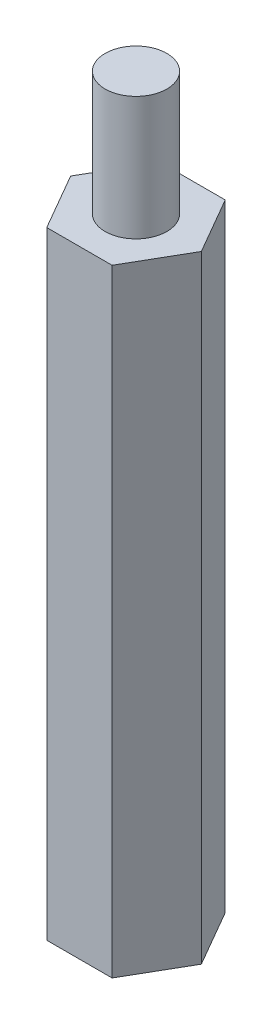
ISO-10303-21;
HEADER;
FILE_DESCRIPTION(('STEP AP214'),'2;1');
FILE_NAME('part.step','',(''),(''),'','','');
FILE_SCHEMA(('AUTOMOTIVE_DESIGN { 1 0 10303 214 1 1 1 1 }'));
ENDSEC;
DATA;
#1=APPLICATION_CONTEXT('core data for automotive mechanical design processes');
#2=APPLICATION_PROTOCOL_DEFINITION('international standard','automotive_design',2000,#1);
#3=PRODUCT_CONTEXT('',#1,'mechanical');
#4=PRODUCT('Part','Part','',(#3));
#5=PRODUCT_RELATED_PRODUCT_CATEGORY('part','',(#4));
#6=PRODUCT_DEFINITION_FORMATION('','',#4);
#7=PRODUCT_DEFINITION_CONTEXT('part definition',#1,'design');
#8=PRODUCT_DEFINITION('design','',#6,#7);
#9=PRODUCT_DEFINITION_SHAPE('','',#8);
#10=(LENGTH_UNIT() NAMED_UNIT(*) SI_UNIT(.MILLI.,.METRE.));
#11=(NAMED_UNIT(*) PLANE_ANGLE_UNIT() SI_UNIT($,.RADIAN.));
#12=(NAMED_UNIT(*) SI_UNIT($,.STERADIAN.) SOLID_ANGLE_UNIT());
#13=UNCERTAINTY_MEASURE_WITH_UNIT(LENGTH_MEASURE(1.E-05),#10,'distance_accuracy_value','');
#14=(GEOMETRIC_REPRESENTATION_CONTEXT(3) GLOBAL_UNCERTAINTY_ASSIGNED_CONTEXT((#13)) GLOBAL_UNIT_ASSIGNED_CONTEXT((#10,
#11,#12)) REPRESENTATION_CONTEXT('',''));
#15=CARTESIAN_POINT('',(0.,0.,0.));
#16=DIRECTION('',(0.,0.,1.));
#17=DIRECTION('',(1.,0.,0.));
#18=AXIS2_PLACEMENT_3D('',#15,#16,#17);
#19=CARTESIAN_POINT('',(-1.58771324027147,30.,2.75));
#20=DIRECTION('',(0.,0.,-1.));
#21=DIRECTION('',(-1.,0.,0.));
#22=AXIS2_PLACEMENT_3D('',#19,#20,#21);
#23=PLANE('',#22);
#24=DIRECTION('',(1.,0.,0.));
#25=VECTOR('',#24,1.);
#26=CARTESIAN_POINT('',(-1.58771324027147,0.,2.75));
#27=LINE('',#26,#25);
#28=CARTESIAN_POINT('',(-1.58771324027147,0.,2.75));
#29=VERTEX_POINT('',#28);
#30=CARTESIAN_POINT('',(1.58771324027147,0.,2.75));
#31=VERTEX_POINT('',#30);
#32=EDGE_CURVE('E119',#29,#31,#27,.T.);
#33=ORIENTED_EDGE('',*,*,#32,.T.);
#34=DIRECTION('',(0.,-1.,0.));
#35=VECTOR('',#34,1.);
#36=CARTESIAN_POINT('',(1.58771324027147,30.,2.75));
#37=LINE('',#36,#35);
#38=CARTESIAN_POINT('',(1.58771324027147,30.,2.75));
#39=VERTEX_POINT('',#38);
#40=EDGE_CURVE('E36',#39,#31,#37,.T.);
#41=ORIENTED_EDGE('',*,*,#40,.F.);
#42=DIRECTION('',(1.,0.,0.));
#43=VECTOR('',#42,1.);
#44=CARTESIAN_POINT('',(-1.58771324027147,30.,2.75));
#45=LINE('',#44,#43);
#46=CARTESIAN_POINT('',(-1.58771324027147,30.,2.75));
#47=VERTEX_POINT('',#46);
#48=EDGE_CURVE('E130',#47,#39,#45,.T.);
#49=ORIENTED_EDGE('',*,*,#48,.F.);
#50=DIRECTION('',(0.,-1.,0.));
#51=VECTOR('',#50,1.);
#52=CARTESIAN_POINT('',(-1.58771324027147,30.,2.75));
#53=LINE('',#52,#51);
#54=EDGE_CURVE('E115',#47,#29,#53,.T.);
#55=ORIENTED_EDGE('',*,*,#54,.T.);
#56=EDGE_LOOP('',(#33,#41,#49,#55));
#57=FACE_BOUND('',#56,.T.);
#58=ADVANCED_FACE('F33',(#57),#23,.F.);
#59=CARTESIAN_POINT('',(1.58771324027147,30.,2.75));
#60=DIRECTION('',(-0.866025403784439,0.,-0.5));
#61=DIRECTION('',(-0.5,0.,0.866025403784439));
#62=AXIS2_PLACEMENT_3D('',#59,#60,#61);
#63=PLANE('',#62);
#64=DIRECTION('',(0.5,0.,-0.866025403784439));
#65=VECTOR('',#64,1.);
#66=CARTESIAN_POINT('',(1.58771324027147,0.,2.75));
#67=LINE('',#66,#65);
#68=CARTESIAN_POINT('',(3.17542648054294,0.,0.));
#69=VERTEX_POINT('',#68);
#70=EDGE_CURVE('E122',#31,#69,#67,.T.);
#71=ORIENTED_EDGE('',*,*,#70,.T.);
#72=DIRECTION('',(0.,-1.,0.));
#73=VECTOR('',#72,1.);
#74=CARTESIAN_POINT('',(3.17542648054294,30.,0.));
#75=LINE('',#74,#73);
#76=CARTESIAN_POINT('',(3.17542648054294,30.,0.));
#77=VERTEX_POINT('',#76);
#78=EDGE_CURVE('E133',#77,#69,#75,.T.);
#79=ORIENTED_EDGE('',*,*,#78,.F.);
#80=DIRECTION('',(0.5,0.,-0.866025403784439));
#81=VECTOR('',#80,1.);
#82=CARTESIAN_POINT('',(1.58771324027147,30.,2.75));
#83=LINE('',#82,#81);
#84=EDGE_CURVE('E88',#39,#77,#83,.T.);
#85=ORIENTED_EDGE('',*,*,#84,.F.);
#86=ORIENTED_EDGE('',*,*,#40,.T.);
#87=EDGE_LOOP('',(#71,#79,#85,#86));
#88=FACE_BOUND('',#87,.T.);
#89=ADVANCED_FACE('F138',(#88),#63,.F.);
#90=CARTESIAN_POINT('',(3.17542648054294,30.,0.));
#91=DIRECTION('',(-0.866025403784438,0.,0.5));
#92=DIRECTION('',(0.5,0.,0.866025403784438));
#93=AXIS2_PLACEMENT_3D('',#90,#91,#92);
#94=PLANE('',#93);
#95=DIRECTION('',(-0.5,0.,-0.866025403784438));
#96=VECTOR('',#95,1.);
#97=CARTESIAN_POINT('',(3.17542648054294,0.,0.));
#98=LINE('',#97,#96);
#99=CARTESIAN_POINT('',(1.58771324027147,0.,-2.75));
#100=VERTEX_POINT('',#99);
#101=EDGE_CURVE('E125',#69,#100,#98,.T.);
#102=ORIENTED_EDGE('',*,*,#101,.T.);
#103=DIRECTION('',(0.,-1.,0.));
#104=VECTOR('',#103,1.);
#105=CARTESIAN_POINT('',(1.58771324027147,30.,-2.75));
#106=LINE('',#105,#104);
#107=CARTESIAN_POINT('',(1.58771324027147,30.,-2.75));
#108=VERTEX_POINT('',#107);
#109=EDGE_CURVE('E110',#108,#100,#106,.T.);
#110=ORIENTED_EDGE('',*,*,#109,.F.);
#111=DIRECTION('',(-0.5,0.,-0.866025403784438));
#112=VECTOR('',#111,1.);
#113=CARTESIAN_POINT('',(3.17542648054294,30.,0.));
#114=LINE('',#113,#112);
#115=EDGE_CURVE('E101',#77,#108,#114,.T.);
#116=ORIENTED_EDGE('',*,*,#115,.F.);
#117=ORIENTED_EDGE('',*,*,#78,.T.);
#118=EDGE_LOOP('',(#102,#110,#116,#117));
#119=FACE_BOUND('',#118,.T.);
#120=ADVANCED_FACE('F144',(#119),#94,.F.);
#121=CARTESIAN_POINT('',(1.58771324027147,30.,-2.75));
#122=DIRECTION('',(0.,0.,1.));
#123=DIRECTION('',(1.,0.,0.));
#124=AXIS2_PLACEMENT_3D('',#121,#122,#123);
#125=PLANE('',#124);
#126=DIRECTION('',(-1.,0.,0.));
#127=VECTOR('',#126,1.);
#128=CARTESIAN_POINT('',(1.58771324027147,0.,-2.75));
#129=LINE('',#128,#127);
#130=CARTESIAN_POINT('',(-1.58771324027147,0.,-2.75));
#131=VERTEX_POINT('',#130);
#132=EDGE_CURVE('E109',#100,#131,#129,.T.);
#133=ORIENTED_EDGE('',*,*,#132,.T.);
#134=DIRECTION('',(0.,-1.,0.));
#135=VECTOR('',#134,1.);
#136=CARTESIAN_POINT('',(-1.58771324027147,30.,-2.75));
#137=LINE('',#136,#135);
#138=CARTESIAN_POINT('',(-1.58771324027147,30.,-2.75));
#139=VERTEX_POINT('',#138);
#140=EDGE_CURVE('E106',#139,#131,#137,.T.);
#141=ORIENTED_EDGE('',*,*,#140,.F.);
#142=DIRECTION('',(-1.,0.,0.));
#143=VECTOR('',#142,1.);
#144=CARTESIAN_POINT('',(1.58771324027147,30.,-2.75));
#145=LINE('',#144,#143);
#146=EDGE_CURVE('E95',#108,#139,#145,.T.);
#147=ORIENTED_EDGE('',*,*,#146,.F.);
#148=ORIENTED_EDGE('',*,*,#109,.T.);
#149=EDGE_LOOP('',(#133,#141,#147,#148));
#150=FACE_BOUND('',#149,.T.);
#151=ADVANCED_FACE('F107',(#150),#125,.F.);
#152=CARTESIAN_POINT('',(-1.58771324027147,30.,-2.75));
#153=DIRECTION('',(0.866025403784439,0.,0.5));
#154=DIRECTION('',(0.5,0.,-0.866025403784439));
#155=AXIS2_PLACEMENT_3D('',#152,#153,#154);
#156=PLANE('',#155);
#157=DIRECTION('',(-0.5,0.,0.866025403784439));
#158=VECTOR('',#157,1.);
#159=CARTESIAN_POINT('',(-1.58771324027147,0.,-2.75));
#160=LINE('',#159,#158);
#161=CARTESIAN_POINT('',(-3.17542648054294,0.,0.));
#162=VERTEX_POINT('',#161);
#163=EDGE_CURVE('E73',#131,#162,#160,.T.);
#164=ORIENTED_EDGE('',*,*,#163,.T.);
#165=DIRECTION('',(0.,-1.,0.));
#166=VECTOR('',#165,1.);
#167=CARTESIAN_POINT('',(-3.17542648054294,30.,0.));
#168=LINE('',#167,#166);
#169=CARTESIAN_POINT('',(-3.17542648054294,30.,0.));
#170=VERTEX_POINT('',#169);
#171=EDGE_CURVE('E111',#170,#162,#168,.T.);
#172=ORIENTED_EDGE('',*,*,#171,.F.);
#173=DIRECTION('',(-0.5,0.,0.866025403784439));
#174=VECTOR('',#173,1.);
#175=CARTESIAN_POINT('',(-1.58771324027147,30.,-2.75));
#176=LINE('',#175,#174);
#177=EDGE_CURVE('E99',#139,#170,#176,.T.);
#178=ORIENTED_EDGE('',*,*,#177,.F.);
#179=ORIENTED_EDGE('',*,*,#140,.T.);
#180=EDGE_LOOP('',(#164,#172,#178,#179));
#181=FACE_BOUND('',#180,.T.);
#182=ADVANCED_FACE('F113',(#181),#156,.F.);
#183=CARTESIAN_POINT('',(-3.17542648054294,30.,0.));
#184=DIRECTION('',(0.866025403784439,0.,-0.5));
#185=DIRECTION('',(-0.5,0.,-0.866025403784439));
#186=AXIS2_PLACEMENT_3D('',#183,#184,#185);
#187=PLANE('',#186);
#188=DIRECTION('',(0.5,0.,0.866025403784439));
#189=VECTOR('',#188,1.);
#190=CARTESIAN_POINT('',(-3.17542648054294,0.,0.));
#191=LINE('',#190,#189);
#192=EDGE_CURVE('E79',#162,#29,#191,.T.);
#193=ORIENTED_EDGE('',*,*,#192,.T.);
#194=ORIENTED_EDGE('',*,*,#54,.F.);
#195=DIRECTION('',(0.5,0.,0.866025403784439));
#196=VECTOR('',#195,1.);
#197=CARTESIAN_POINT('',(-3.17542648054294,30.,0.));
#198=LINE('',#197,#196);
#199=EDGE_CURVE('E50',#170,#47,#198,.T.);
#200=ORIENTED_EDGE('',*,*,#199,.F.);
#201=ORIENTED_EDGE('',*,*,#171,.T.);
#202=EDGE_LOOP('',(#193,#194,#200,#201));
#203=FACE_BOUND('',#202,.T.);
#204=ADVANCED_FACE('F167',(#203),#187,.F.);
#205=CARTESIAN_POINT('',(0.,30.,0.));
#206=DIRECTION('',(0.,1.,0.));
#207=DIRECTION('',(0.,0.,1.));
#208=AXIS2_PLACEMENT_3D('',#205,#206,#207);
#209=PLANE('',#208);
#210=CARTESIAN_POINT('',(0.,30.,0.));
#211=DIRECTION('',(0.,1.,0.));
#212=DIRECTION('',(0.,0.,1.));
#213=AXIS2_PLACEMENT_3D('',#210,#211,#212);
#214=CIRCLE('',#213,1.5);
#215=CARTESIAN_POINT('',(0.,30.,1.5));
#216=VERTEX_POINT('',#215);
#217=EDGE_CURVE('E11',#216,#216,#214,.T.);
#218=ORIENTED_EDGE('',*,*,#217,.F.);
#219=EDGE_LOOP('',(#218));
#220=FACE_BOUND('',#219,.T.);
#221=ORIENTED_EDGE('',*,*,#48,.T.);
#222=ORIENTED_EDGE('',*,*,#84,.T.);
#223=ORIENTED_EDGE('',*,*,#115,.T.);
#224=ORIENTED_EDGE('',*,*,#146,.T.);
#225=ORIENTED_EDGE('',*,*,#177,.T.);
#226=ORIENTED_EDGE('',*,*,#199,.T.);
#227=EDGE_LOOP('',(#221,#222,#223,#224,#225,#226));
#228=FACE_BOUND('',#227,.T.);
#229=ADVANCED_FACE('F97',(#220,#228),#209,.T.);
#230=CARTESIAN_POINT('',(0.,0.,0.));
#231=DIRECTION('',(0.,1.,0.));
#232=DIRECTION('',(0.,0.,1.));
#233=AXIS2_PLACEMENT_3D('',#230,#231,#232);
#234=PLANE('',#233);
#235=CARTESIAN_POINT('',(0.,0.,0.));
#236=DIRECTION('',(0.,-1.,0.));
#237=DIRECTION('',(0.,0.,-1.));
#238=AXIS2_PLACEMENT_3D('',#235,#236,#237);
#239=CIRCLE('',#238,1.5);
#240=CARTESIAN_POINT('',(0.,0.,-1.5));
#241=VERTEX_POINT('',#240);
#242=EDGE_CURVE('E148',#241,#241,#239,.T.);
#243=ORIENTED_EDGE('',*,*,#242,.F.);
#244=EDGE_LOOP('',(#243));
#245=FACE_BOUND('',#244,.T.);
#246=ORIENTED_EDGE('',*,*,#32,.F.);
#247=ORIENTED_EDGE('',*,*,#192,.F.);
#248=ORIENTED_EDGE('',*,*,#163,.F.);
#249=ORIENTED_EDGE('',*,*,#132,.F.);
#250=ORIENTED_EDGE('',*,*,#101,.F.);
#251=ORIENTED_EDGE('',*,*,#70,.F.);
#252=EDGE_LOOP('',(#246,#247,#248,#249,#250,#251));
#253=FACE_BOUND('',#252,.T.);
#254=ADVANCED_FACE('F143',(#245,#253),#234,.F.);
#255=CARTESIAN_POINT('',(0.,6.,0.));
#256=DIRECTION('',(0.,-1.,0.));
#257=DIRECTION('',(0.,0.,-1.));
#258=AXIS2_PLACEMENT_3D('',#255,#256,#257);
#259=CYLINDRICAL_SURFACE('',#258,1.5);
#260=CARTESIAN_POINT('',(0.,6.,0.));
#261=DIRECTION('',(0.,-1.,0.));
#262=DIRECTION('',(0.,0.,-1.));
#263=AXIS2_PLACEMENT_3D('',#260,#261,#262);
#264=CIRCLE('',#263,1.5);
#265=CARTESIAN_POINT('',(0.,6.,-1.5));
#266=VERTEX_POINT('',#265);
#267=EDGE_CURVE('E123',#266,#266,#264,.T.);
#268=ORIENTED_EDGE('',*,*,#267,.F.);
#269=EDGE_LOOP('',(#268));
#270=FACE_BOUND('',#269,.T.);
#271=ORIENTED_EDGE('',*,*,#242,.T.);
#272=EDGE_LOOP('',(#271));
#273=FACE_BOUND('',#272,.T.);
#274=ADVANCED_FACE('F173',(#270,#273),#259,.F.);
#275=CARTESIAN_POINT('',(0.,6.,0.));
#276=DIRECTION('',(0.,-1.,0.));
#277=DIRECTION('',(0.,0.,-1.));
#278=AXIS2_PLACEMENT_3D('',#275,#276,#277);
#279=PLANE('',#278);
#280=ORIENTED_EDGE('',*,*,#267,.T.);
#281=EDGE_LOOP('',(#280));
#282=FACE_BOUND('',#281,.T.);
#283=ADVANCED_FACE('F162',(#282),#279,.T.);
#284=CARTESIAN_POINT('',(0.,36.,0.));
#285=DIRECTION('',(0.,-1.,0.));
#286=DIRECTION('',(0.,0.,-1.));
#287=AXIS2_PLACEMENT_3D('',#284,#285,#286);
#288=CYLINDRICAL_SURFACE('',#287,1.5);
#289=CARTESIAN_POINT('',(0.,36.,0.));
#290=DIRECTION('',(0.,1.,0.));
#291=DIRECTION('',(0.,0.,1.));
#292=AXIS2_PLACEMENT_3D('',#289,#290,#291);
#293=CIRCLE('',#292,1.5);
#294=CARTESIAN_POINT('',(0.,36.,1.5));
#295=VERTEX_POINT('',#294);
#296=EDGE_CURVE('E151',#295,#295,#293,.T.);
#297=ORIENTED_EDGE('',*,*,#296,.F.);
#298=EDGE_LOOP('',(#297));
#299=FACE_BOUND('',#298,.T.);
#300=ORIENTED_EDGE('',*,*,#217,.T.);
#301=EDGE_LOOP('',(#300));
#302=FACE_BOUND('',#301,.T.);
#303=ADVANCED_FACE('F159',(#299,#302),#288,.T.);
#304=CARTESIAN_POINT('',(0.,36.,0.));
#305=DIRECTION('',(0.,1.,0.));
#306=DIRECTION('',(0.,0.,1.));
#307=AXIS2_PLACEMENT_3D('',#304,#305,#306);
#308=PLANE('',#307);
#309=ORIENTED_EDGE('',*,*,#296,.T.);
#310=EDGE_LOOP('',(#309));
#311=FACE_BOUND('',#310,.T.);
#312=ADVANCED_FACE('F157',(#311),#308,.T.);
#313=CLOSED_SHELL('',(#58,#89,#120,#151,#182,#204,#229,#254,#274,#283,#303,#312));
#314=MANIFOLD_SOLID_BREP('B2',#313);
#315=ADVANCED_BREP_SHAPE_REPRESENTATION('',(#18,#314),#14);
#316=SHAPE_DEFINITION_REPRESENTATION(#9,#315);
ENDSEC;
END-ISO-10303-21;
